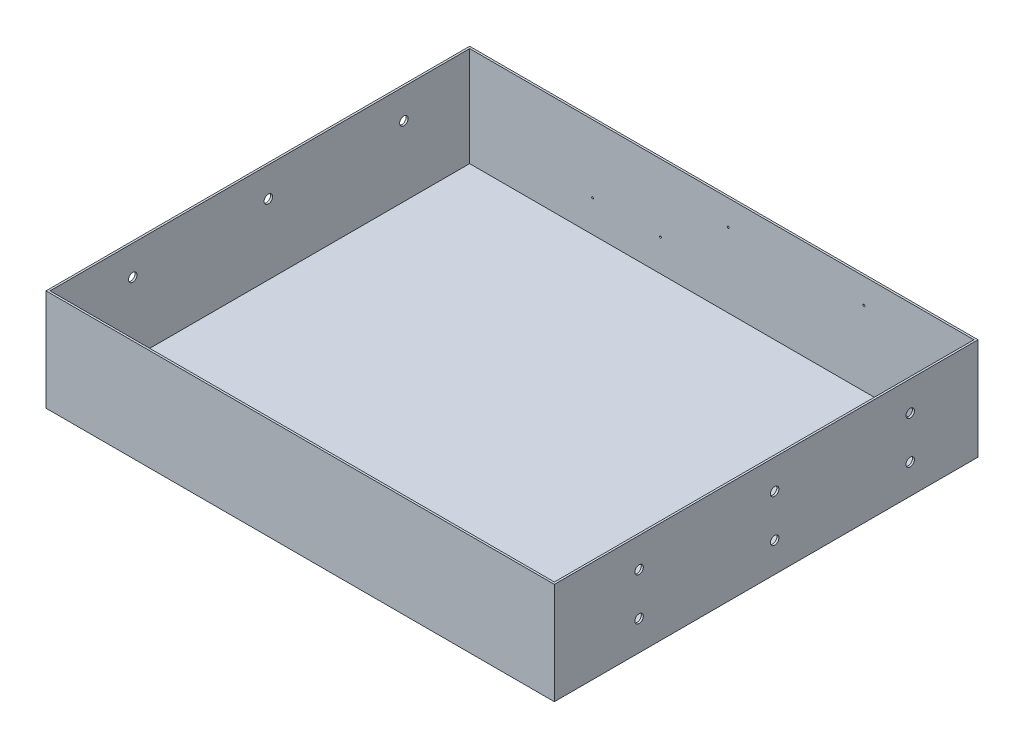
ISO-10303-21;
HEADER;
FILE_DESCRIPTION(('STEP AP214'),'2;1');
FILE_NAME('part.step','',(''),(''),'','','');
FILE_SCHEMA(('AUTOMOTIVE_DESIGN { 1 0 10303 214 1 1 1 1 }'));
ENDSEC;
DATA;
#1=APPLICATION_CONTEXT('core data for automotive mechanical design processes');
#2=APPLICATION_PROTOCOL_DEFINITION('international standard','automotive_design',2000,#1);
#3=PRODUCT_CONTEXT('',#1,'mechanical');
#4=PRODUCT('Part','Part','',(#3));
#5=PRODUCT_RELATED_PRODUCT_CATEGORY('part','',(#4));
#6=PRODUCT_DEFINITION_FORMATION('','',#4);
#7=PRODUCT_DEFINITION_CONTEXT('part definition',#1,'design');
#8=PRODUCT_DEFINITION('design','',#6,#7);
#9=PRODUCT_DEFINITION_SHAPE('','',#8);
#10=(LENGTH_UNIT() NAMED_UNIT(*) SI_UNIT(.MILLI.,.METRE.));
#11=(NAMED_UNIT(*) PLANE_ANGLE_UNIT() SI_UNIT($,.RADIAN.));
#12=(NAMED_UNIT(*) SI_UNIT($,.STERADIAN.) SOLID_ANGLE_UNIT());
#13=UNCERTAINTY_MEASURE_WITH_UNIT(LENGTH_MEASURE(1.E-05),#10,'distance_accuracy_value','');
#14=(GEOMETRIC_REPRESENTATION_CONTEXT(3) GLOBAL_UNCERTAINTY_ASSIGNED_CONTEXT((#13)) GLOBAL_UNIT_ASSIGNED_CONTEXT((#10,
#11,#12)) REPRESENTATION_CONTEXT('',''));
#15=CARTESIAN_POINT('',(0.,0.,0.));
#16=DIRECTION('',(0.,0.,1.));
#17=DIRECTION('',(1.,0.,0.));
#18=AXIS2_PLACEMENT_3D('',#15,#16,#17);
#19=CARTESIAN_POINT('',(-320.548,50.8,-468.376));
#20=DIRECTION('',(0.,0.,-1.));
#21=DIRECTION('',(-1.,0.,0.));
#22=AXIS2_PLACEMENT_3D('',#19,#20,#21);
#23=CYLINDRICAL_SURFACE('',#22,1.52400000000001);
#24=CARTESIAN_POINT('',(-320.548,50.8,-504.952));
#25=DIRECTION('',(0.,0.,1.));
#26=DIRECTION('',(1.,0.,0.));
#27=AXIS2_PLACEMENT_3D('',#24,#25,#26);
#28=CIRCLE('',#27,1.52400000000001);
#29=CARTESIAN_POINT('',(-319.024,50.8,-504.952));
#30=VERTEX_POINT('',#29);
#31=EDGE_CURVE('E46',#30,#30,#28,.T.);
#32=ORIENTED_EDGE('',*,*,#31,.T.);
#33=EDGE_LOOP('',(#32));
#34=FACE_BOUND('',#33,.T.);
#35=CARTESIAN_POINT('',(-320.548,50.8,-508.));
#36=DIRECTION('',(0.,0.,-1.));
#37=DIRECTION('',(-1.,0.,0.));
#38=AXIS2_PLACEMENT_3D('',#35,#36,#37);
#39=CIRCLE('',#38,1.52400000000001);
#40=CARTESIAN_POINT('',(-322.072,50.8,-508.));
#41=VERTEX_POINT('',#40);
#42=EDGE_CURVE('E11',#41,#41,#39,.T.);
#43=ORIENTED_EDGE('',*,*,#42,.T.);
#44=EDGE_LOOP('',(#43));
#45=FACE_BOUND('',#44,.T.);
#46=ADVANCED_FACE('F39',(#34,#45),#23,.F.);
#47=CARTESIAN_POINT('',(-218.948,50.8,-468.376));
#48=DIRECTION('',(0.,0.,-1.));
#49=DIRECTION('',(-1.,0.,0.));
#50=AXIS2_PLACEMENT_3D('',#47,#48,#49);
#51=CYLINDRICAL_SURFACE('',#50,1.52400000000001);
#52=CARTESIAN_POINT('',(-218.948,50.8,-504.952));
#53=DIRECTION('',(0.,0.,1.));
#54=DIRECTION('',(1.,0.,0.));
#55=AXIS2_PLACEMENT_3D('',#52,#53,#54);
#56=CIRCLE('',#55,1.52400000000001);
#57=CARTESIAN_POINT('',(-217.424,50.8,-504.952));
#58=VERTEX_POINT('',#57);
#59=EDGE_CURVE('E228',#58,#58,#56,.T.);
#60=ORIENTED_EDGE('',*,*,#59,.T.);
#61=EDGE_LOOP('',(#60));
#62=FACE_BOUND('',#61,.T.);
#63=CARTESIAN_POINT('',(-218.948,50.8,-508.));
#64=DIRECTION('',(0.,0.,-1.));
#65=DIRECTION('',(-1.,0.,0.));
#66=AXIS2_PLACEMENT_3D('',#63,#64,#65);
#67=CIRCLE('',#66,1.52400000000001);
#68=CARTESIAN_POINT('',(-220.472,50.8,-508.));
#69=VERTEX_POINT('',#68);
#70=EDGE_CURVE('E231',#69,#69,#67,.T.);
#71=ORIENTED_EDGE('',*,*,#70,.T.);
#72=EDGE_LOOP('',(#71));
#73=FACE_BOUND('',#72,.T.);
#74=ADVANCED_FACE('F288',(#62,#73),#51,.F.);
#75=CARTESIAN_POINT('',(-117.348,114.3,-468.376));
#76=DIRECTION('',(0.,0.,-1.));
#77=DIRECTION('',(-1.,0.,0.));
#78=AXIS2_PLACEMENT_3D('',#75,#76,#77);
#79=CYLINDRICAL_SURFACE('',#78,1.52400000000001);
#80=CARTESIAN_POINT('',(-117.348,114.3,-504.952));
#81=DIRECTION('',(0.,0.,1.));
#82=DIRECTION('',(1.,0.,0.));
#83=AXIS2_PLACEMENT_3D('',#80,#81,#82);
#84=CIRCLE('',#83,1.52400000000001);
#85=CARTESIAN_POINT('',(-115.824,114.3,-504.952));
#86=VERTEX_POINT('',#85);
#87=EDGE_CURVE('E217',#86,#86,#84,.T.);
#88=ORIENTED_EDGE('',*,*,#87,.T.);
#89=EDGE_LOOP('',(#88));
#90=FACE_BOUND('',#89,.T.);
#91=CARTESIAN_POINT('',(-117.348,114.3,-508.));
#92=DIRECTION('',(0.,0.,-1.));
#93=DIRECTION('',(-1.,0.,0.));
#94=AXIS2_PLACEMENT_3D('',#91,#92,#93);
#95=CIRCLE('',#94,1.52400000000001);
#96=CARTESIAN_POINT('',(-118.872,114.3,-508.));
#97=VERTEX_POINT('',#96);
#98=EDGE_CURVE('E225',#97,#97,#95,.T.);
#99=ORIENTED_EDGE('',*,*,#98,.T.);
#100=EDGE_LOOP('',(#99));
#101=FACE_BOUND('',#100,.T.);
#102=ADVANCED_FACE('F292',(#90,#101),#79,.F.);
#103=CARTESIAN_POINT('',(254.,44.45,-1.66533453693773E-13));
#104=DIRECTION('',(-1.,0.,0.));
#105=DIRECTION('',(0.,0.,1.));
#106=AXIS2_PLACEMENT_3D('',#103,#104,#105);
#107=CYLINDRICAL_SURFACE('',#106,6.35);
#108=CARTESIAN_POINT('',(250.952,44.45,-1.66533453693773E-13));
#109=DIRECTION('',(-1.,0.,0.));
#110=DIRECTION('',(0.,0.,1.));
#111=AXIS2_PLACEMENT_3D('',#108,#109,#110);
#112=CIRCLE('',#111,6.35);
#113=CARTESIAN_POINT('',(250.952,44.45,6.34999999999983));
#114=VERTEX_POINT('',#113);
#115=EDGE_CURVE('E211',#114,#114,#112,.T.);
#116=ORIENTED_EDGE('',*,*,#115,.T.);
#117=EDGE_LOOP('',(#116));
#118=FACE_BOUND('',#117,.T.);
#119=CARTESIAN_POINT('',(254.,44.45,-1.66533453693773E-13));
#120=DIRECTION('',(-1.,0.,0.));
#121=DIRECTION('',(0.,0.,1.));
#122=AXIS2_PLACEMENT_3D('',#119,#120,#121);
#123=CIRCLE('',#122,6.35);
#124=CARTESIAN_POINT('',(254.,44.45,6.34999999999983));
#125=VERTEX_POINT('',#124);
#126=EDGE_CURVE('E214',#125,#125,#123,.T.);
#127=ORIENTED_EDGE('',*,*,#126,.F.);
#128=EDGE_LOOP('',(#127));
#129=FACE_BOUND('',#128,.T.);
#130=ADVANCED_FACE('F297',(#118,#129),#107,.F.);
#131=CARTESIAN_POINT('',(254.,44.45,-203.2));
#132=DIRECTION('',(-1.,0.,0.));
#133=DIRECTION('',(0.,0.,1.));
#134=AXIS2_PLACEMENT_3D('',#131,#132,#133);
#135=CYLINDRICAL_SURFACE('',#134,6.35);
#136=CARTESIAN_POINT('',(250.952,44.45,-203.2));
#137=DIRECTION('',(-1.,0.,0.));
#138=DIRECTION('',(0.,0.,1.));
#139=AXIS2_PLACEMENT_3D('',#136,#137,#138);
#140=CIRCLE('',#139,6.35);
#141=CARTESIAN_POINT('',(250.952,44.45,-196.85));
#142=VERTEX_POINT('',#141);
#143=EDGE_CURVE('E205',#142,#142,#140,.T.);
#144=ORIENTED_EDGE('',*,*,#143,.T.);
#145=EDGE_LOOP('',(#144));
#146=FACE_BOUND('',#145,.T.);
#147=CARTESIAN_POINT('',(254.,44.45,-203.2));
#148=DIRECTION('',(-1.,0.,0.));
#149=DIRECTION('',(0.,0.,1.));
#150=AXIS2_PLACEMENT_3D('',#147,#148,#149);
#151=CIRCLE('',#150,6.35);
#152=CARTESIAN_POINT('',(254.,44.45,-196.85));
#153=VERTEX_POINT('',#152);
#154=EDGE_CURVE('E208',#153,#153,#151,.T.);
#155=ORIENTED_EDGE('',*,*,#154,.F.);
#156=EDGE_LOOP('',(#155));
#157=FACE_BOUND('',#156,.T.);
#158=ADVANCED_FACE('F304',(#146,#157),#135,.F.);
#159=CARTESIAN_POINT('',(254.,44.45,-406.4));
#160=DIRECTION('',(-1.,0.,0.));
#161=DIRECTION('',(0.,0.,1.));
#162=AXIS2_PLACEMENT_3D('',#159,#160,#161);
#163=CYLINDRICAL_SURFACE('',#162,6.35);
#164=CARTESIAN_POINT('',(250.952,44.45,-406.4));
#165=DIRECTION('',(-1.,0.,0.));
#166=DIRECTION('',(0.,0.,1.));
#167=AXIS2_PLACEMENT_3D('',#164,#165,#166);
#168=CIRCLE('',#167,6.35);
#169=CARTESIAN_POINT('',(250.952,44.45,-400.05));
#170=VERTEX_POINT('',#169);
#171=EDGE_CURVE('E199',#170,#170,#168,.T.);
#172=ORIENTED_EDGE('',*,*,#171,.T.);
#173=EDGE_LOOP('',(#172));
#174=FACE_BOUND('',#173,.T.);
#175=CARTESIAN_POINT('',(254.,44.45,-406.4));
#176=DIRECTION('',(-1.,0.,0.));
#177=DIRECTION('',(0.,0.,1.));
#178=AXIS2_PLACEMENT_3D('',#175,#176,#177);
#179=CIRCLE('',#178,6.35);
#180=CARTESIAN_POINT('',(254.,44.45,-400.05));
#181=VERTEX_POINT('',#180);
#182=EDGE_CURVE('E202',#181,#181,#179,.T.);
#183=ORIENTED_EDGE('',*,*,#182,.F.);
#184=EDGE_LOOP('',(#183));
#185=FACE_BOUND('',#184,.T.);
#186=ADVANCED_FACE('F308',(#174,#185),#163,.F.);
#187=CARTESIAN_POINT('',(254.,107.95,-1.66533453693773E-13));
#188=DIRECTION('',(-1.,0.,0.));
#189=DIRECTION('',(0.,0.,1.));
#190=AXIS2_PLACEMENT_3D('',#187,#188,#189);
#191=CYLINDRICAL_SURFACE('',#190,6.35);
#192=CARTESIAN_POINT('',(250.952,107.95,-1.66533453693773E-13));
#193=DIRECTION('',(-1.,0.,0.));
#194=DIRECTION('',(0.,0.,1.));
#195=AXIS2_PLACEMENT_3D('',#192,#193,#194);
#196=CIRCLE('',#195,6.35);
#197=CARTESIAN_POINT('',(250.952,107.95,6.34999999999983));
#198=VERTEX_POINT('',#197);
#199=EDGE_CURVE('E193',#198,#198,#196,.T.);
#200=ORIENTED_EDGE('',*,*,#199,.T.);
#201=EDGE_LOOP('',(#200));
#202=FACE_BOUND('',#201,.T.);
#203=CARTESIAN_POINT('',(254.,107.95,-1.66533453693773E-13));
#204=DIRECTION('',(-1.,0.,0.));
#205=DIRECTION('',(0.,0.,1.));
#206=AXIS2_PLACEMENT_3D('',#203,#204,#205);
#207=CIRCLE('',#206,6.35);
#208=CARTESIAN_POINT('',(254.,107.95,6.34999999999983));
#209=VERTEX_POINT('',#208);
#210=EDGE_CURVE('E196',#209,#209,#207,.T.);
#211=ORIENTED_EDGE('',*,*,#210,.F.);
#212=EDGE_LOOP('',(#211));
#213=FACE_BOUND('',#212,.T.);
#214=ADVANCED_FACE('F312',(#202,#213),#191,.F.);
#215=CARTESIAN_POINT('',(254.,107.95,-203.2));
#216=DIRECTION('',(-1.,0.,0.));
#217=DIRECTION('',(0.,0.,1.));
#218=AXIS2_PLACEMENT_3D('',#215,#216,#217);
#219=CYLINDRICAL_SURFACE('',#218,6.35);
#220=CARTESIAN_POINT('',(250.952,107.95,-203.2));
#221=DIRECTION('',(-1.,0.,0.));
#222=DIRECTION('',(0.,0.,1.));
#223=AXIS2_PLACEMENT_3D('',#220,#221,#222);
#224=CIRCLE('',#223,6.35);
#225=CARTESIAN_POINT('',(250.952,107.95,-196.85));
#226=VERTEX_POINT('',#225);
#227=EDGE_CURVE('E187',#226,#226,#224,.T.);
#228=ORIENTED_EDGE('',*,*,#227,.T.);
#229=EDGE_LOOP('',(#228));
#230=FACE_BOUND('',#229,.T.);
#231=CARTESIAN_POINT('',(254.,107.95,-203.2));
#232=DIRECTION('',(-1.,0.,0.));
#233=DIRECTION('',(0.,0.,1.));
#234=AXIS2_PLACEMENT_3D('',#231,#232,#233);
#235=CIRCLE('',#234,6.35);
#236=CARTESIAN_POINT('',(254.,107.95,-196.85));
#237=VERTEX_POINT('',#236);
#238=EDGE_CURVE('E190',#237,#237,#235,.T.);
#239=ORIENTED_EDGE('',*,*,#238,.F.);
#240=EDGE_LOOP('',(#239));
#241=FACE_BOUND('',#240,.T.);
#242=ADVANCED_FACE('F316',(#230,#241),#219,.F.);
#243=CARTESIAN_POINT('',(254.,107.95,-1.66533453693773E-13));
#244=DIRECTION('',(-1.,0.,0.));
#245=DIRECTION('',(0.,0.,1.));
#246=AXIS2_PLACEMENT_3D('',#243,#244,#245);
#247=CYLINDRICAL_SURFACE('',#246,6.35);
#248=CARTESIAN_POINT('',(-504.952,107.95,0.));
#249=DIRECTION('',(1.,0.,0.));
#250=DIRECTION('',(0.,0.,-1.));
#251=AXIS2_PLACEMENT_3D('',#248,#249,#250);
#252=CIRCLE('',#251,6.35);
#253=CARTESIAN_POINT('',(-504.952,107.95,-6.35000000000005));
#254=VERTEX_POINT('',#253);
#255=EDGE_CURVE('E181',#254,#254,#252,.T.);
#256=ORIENTED_EDGE('',*,*,#255,.T.);
#257=EDGE_LOOP('',(#256));
#258=FACE_BOUND('',#257,.T.);
#259=CARTESIAN_POINT('',(-508.,107.95,0.));
#260=DIRECTION('',(-1.,0.,0.));
#261=DIRECTION('',(0.,0.,1.));
#262=AXIS2_PLACEMENT_3D('',#259,#260,#261);
#263=CIRCLE('',#262,6.35);
#264=CARTESIAN_POINT('',(-508.,107.95,6.35));
#265=VERTEX_POINT('',#264);
#266=EDGE_CURVE('E184',#265,#265,#263,.T.);
#267=ORIENTED_EDGE('',*,*,#266,.T.);
#268=EDGE_LOOP('',(#267));
#269=FACE_BOUND('',#268,.T.);
#270=ADVANCED_FACE('F320',(#258,#269),#247,.F.);
#271=CARTESIAN_POINT('',(254.,107.95,-203.2));
#272=DIRECTION('',(-1.,0.,0.));
#273=DIRECTION('',(0.,0.,1.));
#274=AXIS2_PLACEMENT_3D('',#271,#272,#273);
#275=CYLINDRICAL_SURFACE('',#274,6.35);
#276=CARTESIAN_POINT('',(-504.952,107.95,-203.2));
#277=DIRECTION('',(1.,0.,0.));
#278=DIRECTION('',(0.,0.,-1.));
#279=AXIS2_PLACEMENT_3D('',#276,#277,#278);
#280=CIRCLE('',#279,6.35);
#281=CARTESIAN_POINT('',(-504.952,107.95,-209.55));
#282=VERTEX_POINT('',#281);
#283=EDGE_CURVE('E170',#282,#282,#280,.T.);
#284=ORIENTED_EDGE('',*,*,#283,.T.);
#285=EDGE_LOOP('',(#284));
#286=FACE_BOUND('',#285,.T.);
#287=CARTESIAN_POINT('',(-508.,107.95,-203.2));
#288=DIRECTION('',(-1.,0.,0.));
#289=DIRECTION('',(0.,0.,1.));
#290=AXIS2_PLACEMENT_3D('',#287,#288,#289);
#291=CIRCLE('',#290,6.35);
#292=CARTESIAN_POINT('',(-508.,107.95,-196.85));
#293=VERTEX_POINT('',#292);
#294=EDGE_CURVE('E178',#293,#293,#291,.T.);
#295=ORIENTED_EDGE('',*,*,#294,.T.);
#296=EDGE_LOOP('',(#295));
#297=FACE_BOUND('',#296,.T.);
#298=ADVANCED_FACE('F324',(#286,#297),#275,.F.);
#299=CARTESIAN_POINT('',(-508.,152.4,-508.));
#300=DIRECTION('',(1.,0.,0.));
#301=DIRECTION('',(0.,0.,-1.));
#302=AXIS2_PLACEMENT_3D('',#299,#300,#301);
#303=PLANE('',#302);
#304=ORIENTED_EDGE('',*,*,#266,.F.);
#305=EDGE_LOOP('',(#304));
#306=FACE_BOUND('',#305,.T.);
#307=ORIENTED_EDGE('',*,*,#294,.F.);
#308=EDGE_LOOP('',(#307));
#309=FACE_BOUND('',#308,.T.);
#310=CARTESIAN_POINT('',(-508.,107.95,-406.4));
#311=DIRECTION('',(-1.,0.,0.));
#312=DIRECTION('',(0.,0.,1.));
#313=AXIS2_PLACEMENT_3D('',#310,#311,#312);
#314=CIRCLE('',#313,6.35);
#315=CARTESIAN_POINT('',(-508.,107.95,-400.05));
#316=VERTEX_POINT('',#315);
#317=EDGE_CURVE('E221',#316,#316,#314,.T.);
#318=ORIENTED_EDGE('',*,*,#317,.F.);
#319=EDGE_LOOP('',(#318));
#320=FACE_BOUND('',#319,.T.);
#321=DIRECTION('',(0.,0.,1.));
#322=VECTOR('',#321,1.);
#323=CARTESIAN_POINT('',(-508.,0.,-508.));
#324=LINE('',#323,#322);
#325=CARTESIAN_POINT('',(-508.,0.,-508.));
#326=VERTEX_POINT('',#325);
#327=CARTESIAN_POINT('',(-508.,0.,127.));
#328=VERTEX_POINT('',#327);
#329=EDGE_CURVE('E154',#326,#328,#324,.T.);
#330=ORIENTED_EDGE('',*,*,#329,.T.);
#331=DIRECTION('',(0.,-1.,0.));
#332=VECTOR('',#331,1.);
#333=CARTESIAN_POINT('',(-508.,152.4,127.));
#334=LINE('',#333,#332);
#335=CARTESIAN_POINT('',(-508.,152.4,127.));
#336=VERTEX_POINT('',#335);
#337=EDGE_CURVE('E168',#336,#328,#334,.T.);
#338=ORIENTED_EDGE('',*,*,#337,.F.);
#339=DIRECTION('',(0.,0.,1.));
#340=VECTOR('',#339,1.);
#341=CARTESIAN_POINT('',(-508.,152.4,-508.));
#342=LINE('',#341,#340);
#343=CARTESIAN_POINT('',(-508.,152.4,-508.));
#344=VERTEX_POINT('',#343);
#345=EDGE_CURVE('E147',#344,#336,#342,.T.);
#346=ORIENTED_EDGE('',*,*,#345,.F.);
#347=DIRECTION('',(0.,-1.,0.));
#348=VECTOR('',#347,1.);
#349=CARTESIAN_POINT('',(-508.,152.4,-508.));
#350=LINE('',#349,#348);
#351=EDGE_CURVE('E153',#344,#326,#350,.T.);
#352=ORIENTED_EDGE('',*,*,#351,.T.);
#353=EDGE_LOOP('',(#330,#338,#346,#352));
#354=FACE_BOUND('',#353,.T.);
#355=ADVANCED_FACE('F328',(#306,#309,#320,#354),#303,.F.);
#356=CARTESIAN_POINT('',(-508.,152.4,127.));
#357=DIRECTION('',(0.,0.,-1.));
#358=DIRECTION('',(-1.,0.,0.));
#359=AXIS2_PLACEMENT_3D('',#356,#357,#358);
#360=PLANE('',#359);
#361=DIRECTION('',(1.,0.,0.));
#362=VECTOR('',#361,1.);
#363=CARTESIAN_POINT('',(-508.,0.,127.));
#364=LINE('',#363,#362);
#365=CARTESIAN_POINT('',(254.,0.,127.));
#366=VERTEX_POINT('',#365);
#367=EDGE_CURVE('E157',#328,#366,#364,.T.);
#368=ORIENTED_EDGE('',*,*,#367,.T.);
#369=DIRECTION('',(0.,-1.,0.));
#370=VECTOR('',#369,1.);
#371=CARTESIAN_POINT('',(254.,152.4,127.));
#372=LINE('',#371,#370);
#373=CARTESIAN_POINT('',(254.,152.4,127.));
#374=VERTEX_POINT('',#373);
#375=EDGE_CURVE('E165',#374,#366,#372,.T.);
#376=ORIENTED_EDGE('',*,*,#375,.F.);
#377=DIRECTION('',(1.,0.,0.));
#378=VECTOR('',#377,1.);
#379=CARTESIAN_POINT('',(-508.,152.4,127.));
#380=LINE('',#379,#378);
#381=EDGE_CURVE('E91',#336,#374,#380,.T.);
#382=ORIENTED_EDGE('',*,*,#381,.F.);
#383=ORIENTED_EDGE('',*,*,#337,.T.);
#384=EDGE_LOOP('',(#368,#376,#382,#383));
#385=FACE_BOUND('',#384,.T.);
#386=ADVANCED_FACE('F281',(#385),#360,.F.);
#387=CARTESIAN_POINT('',(254.,152.4,-508.));
#388=DIRECTION('',(-1.,0.,0.));
#389=DIRECTION('',(0.,0.,1.));
#390=AXIS2_PLACEMENT_3D('',#387,#388,#389);
#391=PLANE('',#390);
#392=ORIENTED_EDGE('',*,*,#126,.T.);
#393=EDGE_LOOP('',(#392));
#394=FACE_BOUND('',#393,.T.);
#395=ORIENTED_EDGE('',*,*,#154,.T.);
#396=EDGE_LOOP('',(#395));
#397=FACE_BOUND('',#396,.T.);
#398=ORIENTED_EDGE('',*,*,#182,.T.);
#399=EDGE_LOOP('',(#398));
#400=FACE_BOUND('',#399,.T.);
#401=ORIENTED_EDGE('',*,*,#210,.T.);
#402=EDGE_LOOP('',(#401));
#403=FACE_BOUND('',#402,.T.);
#404=ORIENTED_EDGE('',*,*,#238,.T.);
#405=EDGE_LOOP('',(#404));
#406=FACE_BOUND('',#405,.T.);
#407=CARTESIAN_POINT('',(254.,107.95,-406.4));
#408=DIRECTION('',(-1.,0.,0.));
#409=DIRECTION('',(0.,0.,1.));
#410=AXIS2_PLACEMENT_3D('',#407,#408,#409);
#411=CIRCLE('',#410,6.35);
#412=CARTESIAN_POINT('',(254.,107.95,-400.05));
#413=VERTEX_POINT('',#412);
#414=EDGE_CURVE('E175',#413,#413,#411,.T.);
#415=ORIENTED_EDGE('',*,*,#414,.T.);
#416=EDGE_LOOP('',(#415));
#417=FACE_BOUND('',#416,.T.);
#418=DIRECTION('',(0.,0.,-1.));
#419=VECTOR('',#418,1.);
#420=CARTESIAN_POINT('',(254.,0.,-508.));
#421=LINE('',#420,#419);
#422=CARTESIAN_POINT('',(254.,0.,-508.));
#423=VERTEX_POINT('',#422);
#424=EDGE_CURVE('E159',#366,#423,#421,.T.);
#425=ORIENTED_EDGE('',*,*,#424,.T.);
#426=DIRECTION('',(0.,-1.,0.));
#427=VECTOR('',#426,1.);
#428=CARTESIAN_POINT('',(254.,152.4,-508.));
#429=LINE('',#428,#427);
#430=CARTESIAN_POINT('',(254.,152.4,-508.));
#431=VERTEX_POINT('',#430);
#432=EDGE_CURVE('E163',#431,#423,#429,.T.);
#433=ORIENTED_EDGE('',*,*,#432,.F.);
#434=DIRECTION('',(0.,0.,-1.));
#435=VECTOR('',#434,1.);
#436=CARTESIAN_POINT('',(254.,152.4,-508.));
#437=LINE('',#436,#435);
#438=EDGE_CURVE('E150',#374,#431,#437,.T.);
#439=ORIENTED_EDGE('',*,*,#438,.F.);
#440=ORIENTED_EDGE('',*,*,#375,.T.);
#441=EDGE_LOOP('',(#425,#433,#439,#440));
#442=FACE_BOUND('',#441,.T.);
#443=ADVANCED_FACE('F271',(#394,#397,#400,#403,#406,#417,#442),#391,.F.);
#444=CARTESIAN_POINT('',(-508.,152.4,-508.));
#445=DIRECTION('',(0.,0.,1.));
#446=DIRECTION('',(1.,0.,0.));
#447=AXIS2_PLACEMENT_3D('',#444,#445,#446);
#448=PLANE('',#447);
#449=ORIENTED_EDGE('',*,*,#42,.F.);
#450=EDGE_LOOP('',(#449));
#451=FACE_BOUND('',#450,.T.);
#452=ORIENTED_EDGE('',*,*,#70,.F.);
#453=EDGE_LOOP('',(#452));
#454=FACE_BOUND('',#453,.T.);
#455=ORIENTED_EDGE('',*,*,#98,.F.);
#456=EDGE_LOOP('',(#455));
#457=FACE_BOUND('',#456,.T.);
#458=CARTESIAN_POINT('',(85.852,114.3,-508.));
#459=DIRECTION('',(0.,0.,-1.));
#460=DIRECTION('',(-1.,0.,0.));
#461=AXIS2_PLACEMENT_3D('',#458,#459,#460);
#462=CIRCLE('',#461,1.52400000000001);
#463=CARTESIAN_POINT('',(84.328,114.3,-508.));
#464=VERTEX_POINT('',#463);
#465=EDGE_CURVE('E222',#464,#464,#462,.T.);
#466=ORIENTED_EDGE('',*,*,#465,.F.);
#467=EDGE_LOOP('',(#466));
#468=FACE_BOUND('',#467,.T.);
#469=DIRECTION('',(-1.,0.,0.));
#470=VECTOR('',#469,1.);
#471=CARTESIAN_POINT('',(-508.,0.,-508.));
#472=LINE('',#471,#470);
#473=EDGE_CURVE('E83',#423,#326,#472,.T.);
#474=ORIENTED_EDGE('',*,*,#473,.T.);
#475=ORIENTED_EDGE('',*,*,#351,.F.);
#476=DIRECTION('',(-1.,0.,0.));
#477=VECTOR('',#476,1.);
#478=CARTESIAN_POINT('',(-508.,152.4,-508.));
#479=LINE('',#478,#477);
#480=EDGE_CURVE('E62',#431,#344,#479,.T.);
#481=ORIENTED_EDGE('',*,*,#480,.F.);
#482=ORIENTED_EDGE('',*,*,#432,.T.);
#483=EDGE_LOOP('',(#474,#475,#481,#482));
#484=FACE_BOUND('',#483,.T.);
#485=ADVANCED_FACE('F268',(#451,#454,#457,#468,#484),#448,.F.);
#486=CARTESIAN_POINT('',(-508.,152.4,127.));
#487=DIRECTION('',(0.,1.,0.));
#488=DIRECTION('',(0.,0.,1.));
#489=AXIS2_PLACEMENT_3D('',#486,#487,#488);
#490=PLANE('',#489);
#491=DIRECTION('',(0.,0.,1.));
#492=VECTOR('',#491,1.);
#493=CARTESIAN_POINT('',(-504.952,152.4,-508.));
#494=LINE('',#493,#492);
#495=CARTESIAN_POINT('',(-504.952,152.4,-504.952));
#496=VERTEX_POINT('',#495);
#497=CARTESIAN_POINT('',(-504.952,152.4,123.952));
#498=VERTEX_POINT('',#497);
#499=EDGE_CURVE('E136',#496,#498,#494,.T.);
#500=ORIENTED_EDGE('',*,*,#499,.F.);
#501=DIRECTION('',(-1.,0.,0.));
#502=VECTOR('',#501,1.);
#503=CARTESIAN_POINT('',(-508.,152.4,-504.952));
#504=LINE('',#503,#502);
#505=CARTESIAN_POINT('',(250.952,152.4,-504.952));
#506=VERTEX_POINT('',#505);
#507=EDGE_CURVE('E145',#506,#496,#504,.T.);
#508=ORIENTED_EDGE('',*,*,#507,.F.);
#509=DIRECTION('',(0.,0.,-1.));
#510=VECTOR('',#509,1.);
#511=CARTESIAN_POINT('',(250.952,152.4,-508.));
#512=LINE('',#511,#510);
#513=CARTESIAN_POINT('',(250.952,152.4,123.952));
#514=VERTEX_POINT('',#513);
#515=EDGE_CURVE('E143',#514,#506,#512,.T.);
#516=ORIENTED_EDGE('',*,*,#515,.F.);
#517=DIRECTION('',(1.,0.,0.));
#518=VECTOR('',#517,1.);
#519=CARTESIAN_POINT('',(-508.,152.4,123.952));
#520=LINE('',#519,#518);
#521=EDGE_CURVE('E128',#498,#514,#520,.T.);
#522=ORIENTED_EDGE('',*,*,#521,.F.);
#523=EDGE_LOOP('',(#500,#508,#516,#522));
#524=FACE_BOUND('',#523,.T.);
#525=ORIENTED_EDGE('',*,*,#345,.T.);
#526=ORIENTED_EDGE('',*,*,#381,.T.);
#527=ORIENTED_EDGE('',*,*,#438,.T.);
#528=ORIENTED_EDGE('',*,*,#480,.T.);
#529=EDGE_LOOP('',(#525,#526,#527,#528));
#530=FACE_BOUND('',#529,.T.);
#531=ADVANCED_FACE('F270',(#524,#530),#490,.T.);
#532=CARTESIAN_POINT('',(-508.,0.,127.));
#533=DIRECTION('',(0.,1.,0.));
#534=DIRECTION('',(0.,0.,1.));
#535=AXIS2_PLACEMENT_3D('',#532,#533,#534);
#536=PLANE('',#535);
#537=ORIENTED_EDGE('',*,*,#329,.F.);
#538=ORIENTED_EDGE('',*,*,#473,.F.);
#539=ORIENTED_EDGE('',*,*,#424,.F.);
#540=ORIENTED_EDGE('',*,*,#367,.F.);
#541=EDGE_LOOP('',(#537,#538,#539,#540));
#542=FACE_BOUND('',#541,.T.);
#543=ADVANCED_FACE('F278',(#542),#536,.F.);
#544=CARTESIAN_POINT('',(-504.952,152.4,-508.));
#545=DIRECTION('',(1.,0.,0.));
#546=DIRECTION('',(0.,0.,-1.));
#547=AXIS2_PLACEMENT_3D('',#544,#545,#546);
#548=PLANE('',#547);
#549=ORIENTED_EDGE('',*,*,#255,.F.);
#550=EDGE_LOOP('',(#549));
#551=FACE_BOUND('',#550,.T.);
#552=ORIENTED_EDGE('',*,*,#283,.F.);
#553=EDGE_LOOP('',(#552));
#554=FACE_BOUND('',#553,.T.);
#555=CARTESIAN_POINT('',(-504.952,107.95,-406.4));
#556=DIRECTION('',(1.,0.,0.));
#557=DIRECTION('',(0.,0.,-1.));
#558=AXIS2_PLACEMENT_3D('',#555,#556,#557);
#559=CIRCLE('',#558,6.35);
#560=CARTESIAN_POINT('',(-504.952,107.95,-412.75));
#561=VERTEX_POINT('',#560);
#562=EDGE_CURVE('E174',#561,#561,#559,.T.);
#563=ORIENTED_EDGE('',*,*,#562,.F.);
#564=EDGE_LOOP('',(#563));
#565=FACE_BOUND('',#564,.T.);
#566=DIRECTION('',(0.,0.,1.));
#567=VECTOR('',#566,1.);
#568=CARTESIAN_POINT('',(-504.952,3.048,-508.));
#569=LINE('',#568,#567);
#570=CARTESIAN_POINT('',(-504.952,3.048,-504.952));
#571=VERTEX_POINT('',#570);
#572=CARTESIAN_POINT('',(-504.952,3.048,123.952));
#573=VERTEX_POINT('',#572);
#574=EDGE_CURVE('E119',#571,#573,#569,.T.);
#575=ORIENTED_EDGE('',*,*,#574,.F.);
#576=DIRECTION('',(0.,-1.,0.));
#577=VECTOR('',#576,1.);
#578=CARTESIAN_POINT('',(-504.952,152.4,-504.952));
#579=LINE('',#578,#577);
#580=EDGE_CURVE('E139',#496,#571,#579,.T.);
#581=ORIENTED_EDGE('',*,*,#580,.F.);
#582=ORIENTED_EDGE('',*,*,#499,.T.);
#583=DIRECTION('',(0.,-1.,0.));
#584=VECTOR('',#583,1.);
#585=CARTESIAN_POINT('',(-504.952,152.4,123.952));
#586=LINE('',#585,#584);
#587=EDGE_CURVE('E131',#498,#573,#586,.T.);
#588=ORIENTED_EDGE('',*,*,#587,.T.);
#589=EDGE_LOOP('',(#575,#581,#582,#588));
#590=FACE_BOUND('',#589,.T.);
#591=ADVANCED_FACE('F253',(#551,#554,#565,#590),#548,.T.);
#592=CARTESIAN_POINT('',(-508.,152.4,123.952));
#593=DIRECTION('',(0.,0.,-1.));
#594=DIRECTION('',(-1.,0.,0.));
#595=AXIS2_PLACEMENT_3D('',#592,#593,#594);
#596=PLANE('',#595);
#597=DIRECTION('',(1.,0.,0.));
#598=VECTOR('',#597,1.);
#599=CARTESIAN_POINT('',(-508.,3.048,123.952));
#600=LINE('',#599,#598);
#601=CARTESIAN_POINT('',(250.952,3.048,123.952));
#602=VERTEX_POINT('',#601);
#603=EDGE_CURVE('E113',#573,#602,#600,.T.);
#604=ORIENTED_EDGE('',*,*,#603,.F.);
#605=ORIENTED_EDGE('',*,*,#587,.F.);
#606=ORIENTED_EDGE('',*,*,#521,.T.);
#607=DIRECTION('',(0.,-1.,0.));
#608=VECTOR('',#607,1.);
#609=CARTESIAN_POINT('',(250.952,152.4,123.952));
#610=LINE('',#609,#608);
#611=EDGE_CURVE('E125',#514,#602,#610,.T.);
#612=ORIENTED_EDGE('',*,*,#611,.T.);
#613=EDGE_LOOP('',(#604,#605,#606,#612));
#614=FACE_BOUND('',#613,.T.);
#615=ADVANCED_FACE('F126',(#614),#596,.T.);
#616=CARTESIAN_POINT('',(250.952,152.4,-508.));
#617=DIRECTION('',(-1.,0.,0.));
#618=DIRECTION('',(0.,0.,1.));
#619=AXIS2_PLACEMENT_3D('',#616,#617,#618);
#620=PLANE('',#619);
#621=ORIENTED_EDGE('',*,*,#115,.F.);
#622=EDGE_LOOP('',(#621));
#623=FACE_BOUND('',#622,.T.);
#624=ORIENTED_EDGE('',*,*,#143,.F.);
#625=EDGE_LOOP('',(#624));
#626=FACE_BOUND('',#625,.T.);
#627=ORIENTED_EDGE('',*,*,#171,.F.);
#628=EDGE_LOOP('',(#627));
#629=FACE_BOUND('',#628,.T.);
#630=ORIENTED_EDGE('',*,*,#199,.F.);
#631=EDGE_LOOP('',(#630));
#632=FACE_BOUND('',#631,.T.);
#633=ORIENTED_EDGE('',*,*,#227,.F.);
#634=EDGE_LOOP('',(#633));
#635=FACE_BOUND('',#634,.T.);
#636=CARTESIAN_POINT('',(250.952,107.95,-406.4));
#637=DIRECTION('',(-1.,0.,0.));
#638=DIRECTION('',(0.,0.,1.));
#639=AXIS2_PLACEMENT_3D('',#636,#637,#638);
#640=CIRCLE('',#639,6.35);
#641=CARTESIAN_POINT('',(250.952,107.95,-400.05));
#642=VERTEX_POINT('',#641);
#643=EDGE_CURVE('E171',#642,#642,#640,.T.);
#644=ORIENTED_EDGE('',*,*,#643,.F.);
#645=EDGE_LOOP('',(#644));
#646=FACE_BOUND('',#645,.T.);
#647=DIRECTION('',(0.,0.,-1.));
#648=VECTOR('',#647,1.);
#649=CARTESIAN_POINT('',(250.952,3.048,-508.));
#650=LINE('',#649,#648);
#651=CARTESIAN_POINT('',(250.952,3.048,-504.952));
#652=VERTEX_POINT('',#651);
#653=EDGE_CURVE('E117',#602,#652,#650,.T.);
#654=ORIENTED_EDGE('',*,*,#653,.F.);
#655=ORIENTED_EDGE('',*,*,#611,.F.);
#656=ORIENTED_EDGE('',*,*,#515,.T.);
#657=DIRECTION('',(0.,-1.,0.));
#658=VECTOR('',#657,1.);
#659=CARTESIAN_POINT('',(250.952,152.4,-504.952));
#660=LINE('',#659,#658);
#661=EDGE_CURVE('E53',#506,#652,#660,.T.);
#662=ORIENTED_EDGE('',*,*,#661,.T.);
#663=EDGE_LOOP('',(#654,#655,#656,#662));
#664=FACE_BOUND('',#663,.T.);
#665=ADVANCED_FACE('F133',(#623,#626,#629,#632,#635,#646,#664),#620,.T.);
#666=CARTESIAN_POINT('',(-508.,152.4,-504.952));
#667=DIRECTION('',(0.,0.,1.));
#668=DIRECTION('',(1.,0.,0.));
#669=AXIS2_PLACEMENT_3D('',#666,#667,#668);
#670=PLANE('',#669);
#671=ORIENTED_EDGE('',*,*,#31,.F.);
#672=EDGE_LOOP('',(#671));
#673=FACE_BOUND('',#672,.T.);
#674=ORIENTED_EDGE('',*,*,#59,.F.);
#675=EDGE_LOOP('',(#674));
#676=FACE_BOUND('',#675,.T.);
#677=ORIENTED_EDGE('',*,*,#87,.F.);
#678=EDGE_LOOP('',(#677));
#679=FACE_BOUND('',#678,.T.);
#680=CARTESIAN_POINT('',(85.852,114.3,-504.952));
#681=DIRECTION('',(0.,0.,1.));
#682=DIRECTION('',(1.,0.,0.));
#683=AXIS2_PLACEMENT_3D('',#680,#681,#682);
#684=CIRCLE('',#683,1.52400000000001);
#685=CARTESIAN_POINT('',(87.376,114.3,-504.952));
#686=VERTEX_POINT('',#685);
#687=EDGE_CURVE('E218',#686,#686,#684,.T.);
#688=ORIENTED_EDGE('',*,*,#687,.F.);
#689=EDGE_LOOP('',(#688));
#690=FACE_BOUND('',#689,.T.);
#691=DIRECTION('',(-1.,0.,0.));
#692=VECTOR('',#691,1.);
#693=CARTESIAN_POINT('',(-508.,3.048,-504.952));
#694=LINE('',#693,#692);
#695=EDGE_CURVE('E134',#652,#571,#694,.T.);
#696=ORIENTED_EDGE('',*,*,#695,.F.);
#697=ORIENTED_EDGE('',*,*,#661,.F.);
#698=ORIENTED_EDGE('',*,*,#507,.T.);
#699=ORIENTED_EDGE('',*,*,#580,.T.);
#700=EDGE_LOOP('',(#696,#697,#698,#699));
#701=FACE_BOUND('',#700,.T.);
#702=ADVANCED_FACE('F238',(#673,#676,#679,#690,#701),#670,.T.);
#703=CARTESIAN_POINT('',(-508.,3.048,127.));
#704=DIRECTION('',(0.,1.,0.));
#705=DIRECTION('',(0.,0.,1.));
#706=AXIS2_PLACEMENT_3D('',#703,#704,#705);
#707=PLANE('',#706);
#708=ORIENTED_EDGE('',*,*,#574,.T.);
#709=ORIENTED_EDGE('',*,*,#603,.T.);
#710=ORIENTED_EDGE('',*,*,#653,.T.);
#711=ORIENTED_EDGE('',*,*,#695,.T.);
#712=EDGE_LOOP('',(#708,#709,#710,#711));
#713=FACE_BOUND('',#712,.T.);
#714=ADVANCED_FACE('F115',(#713),#707,.T.);
#715=CARTESIAN_POINT('',(254.,107.95,-406.4));
#716=DIRECTION('',(-1.,0.,0.));
#717=DIRECTION('',(0.,0.,1.));
#718=AXIS2_PLACEMENT_3D('',#715,#716,#717);
#719=CYLINDRICAL_SURFACE('',#718,6.35);
#720=ORIENTED_EDGE('',*,*,#643,.T.);
#721=EDGE_LOOP('',(#720));
#722=FACE_BOUND('',#721,.T.);
#723=ORIENTED_EDGE('',*,*,#414,.F.);
#724=EDGE_LOOP('',(#723));
#725=FACE_BOUND('',#724,.T.);
#726=ADVANCED_FACE('F353',(#722,#725),#719,.F.);
#727=ORIENTED_EDGE('',*,*,#562,.T.);
#728=EDGE_LOOP('',(#727));
#729=FACE_BOUND('',#728,.T.);
#730=ORIENTED_EDGE('',*,*,#317,.T.);
#731=EDGE_LOOP('',(#730));
#732=FACE_BOUND('',#731,.T.);
#733=ADVANCED_FACE('F362',(#729,#732),#719,.F.);
#734=CARTESIAN_POINT('',(85.852,114.3,-468.376));
#735=DIRECTION('',(0.,0.,-1.));
#736=DIRECTION('',(-1.,0.,0.));
#737=AXIS2_PLACEMENT_3D('',#734,#735,#736);
#738=CYLINDRICAL_SURFACE('',#737,1.52400000000001);
#739=ORIENTED_EDGE('',*,*,#687,.T.);
#740=EDGE_LOOP('',(#739));
#741=FACE_BOUND('',#740,.T.);
#742=ORIENTED_EDGE('',*,*,#465,.T.);
#743=EDGE_LOOP('',(#742));
#744=FACE_BOUND('',#743,.T.);
#745=ADVANCED_FACE('F266',(#741,#744),#738,.F.);
#746=CLOSED_SHELL('',(#46,#74,#102,#130,#158,#186,#214,#242,#270,#298,#355,#386,#443,#485,#531,
#543,#591,#615,#665,#702,#714,#726,#733,#745));
#747=MANIFOLD_SOLID_BREP('B2',#746);
#748=ADVANCED_BREP_SHAPE_REPRESENTATION('',(#18,#747),#14);
#749=SHAPE_DEFINITION_REPRESENTATION(#9,#748);
ENDSEC;
END-ISO-10303-21;
